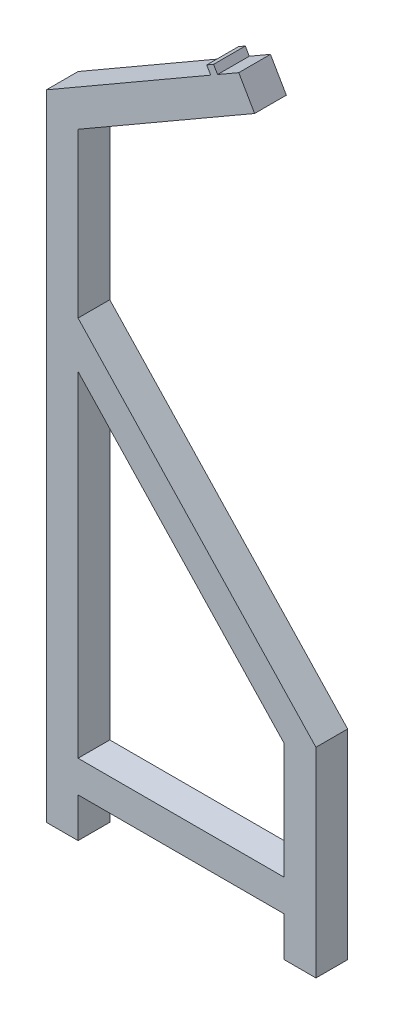
ISO-10303-21;
HEADER;
FILE_DESCRIPTION(('STEP AP214'),'2;1');
FILE_NAME('part.step','',(''),(''),'','','');
FILE_SCHEMA(('AUTOMOTIVE_DESIGN { 1 0 10303 214 1 1 1 1 }'));
ENDSEC;
DATA;
#1=APPLICATION_CONTEXT('core data for automotive mechanical design processes');
#2=APPLICATION_PROTOCOL_DEFINITION('international standard','automotive_design',2000,#1);
#3=PRODUCT_CONTEXT('',#1,'mechanical');
#4=PRODUCT('Part','Part','',(#3));
#5=PRODUCT_RELATED_PRODUCT_CATEGORY('part','',(#4));
#6=PRODUCT_DEFINITION_FORMATION('','',#4);
#7=PRODUCT_DEFINITION_CONTEXT('part definition',#1,'design');
#8=PRODUCT_DEFINITION('design','',#6,#7);
#9=PRODUCT_DEFINITION_SHAPE('','',#8);
#10=(LENGTH_UNIT() NAMED_UNIT(*) SI_UNIT(.MILLI.,.METRE.));
#11=(NAMED_UNIT(*) PLANE_ANGLE_UNIT() SI_UNIT($,.RADIAN.));
#12=(NAMED_UNIT(*) SI_UNIT($,.STERADIAN.) SOLID_ANGLE_UNIT());
#13=UNCERTAINTY_MEASURE_WITH_UNIT(LENGTH_MEASURE(1.E-05),#10,'distance_accuracy_value','');
#14=(GEOMETRIC_REPRESENTATION_CONTEXT(3) GLOBAL_UNCERTAINTY_ASSIGNED_CONTEXT((#13)) GLOBAL_UNIT_ASSIGNED_CONTEXT((#10,
#11,#12)) REPRESENTATION_CONTEXT('',''));
#15=CARTESIAN_POINT('',(0.,0.,0.));
#16=DIRECTION('',(0.,0.,1.));
#17=DIRECTION('',(1.,0.,0.));
#18=AXIS2_PLACEMENT_3D('',#15,#16,#17);
#19=CARTESIAN_POINT('',(0.,0.,4.));
#20=DIRECTION('',(0.,0.,-1.));
#21=DIRECTION('',(-1.,0.,0.));
#22=AXIS2_PLACEMENT_3D('',#19,#20,#21);
#23=PLANE('',#22);
#24=DIRECTION('',(0.,-1.,0.));
#25=VECTOR('',#24,1.);
#26=CARTESIAN_POINT('',(-197.090909090908,-191.272727272729,4.));
#27=LINE('',#26,#25);
#28=CARTESIAN_POINT('',(-197.090909090908,-111.272727272729,4.));
#29=VERTEX_POINT('',#28);
#30=CARTESIAN_POINT('',(-197.090909090908,-191.272727272729,4.));
#31=VERTEX_POINT('',#30);
#32=EDGE_CURVE('E206',#29,#31,#27,.T.);
#33=ORIENTED_EDGE('',*,*,#32,.T.);
#34=DIRECTION('',(1.,0.,0.));
#35=VECTOR('',#34,1.);
#36=CARTESIAN_POINT('',(-197.090909090908,-191.272727272729,4.));
#37=LINE('',#36,#35);
#38=CARTESIAN_POINT('',(-193.090909090908,-191.272727272729,4.));
#39=VERTEX_POINT('',#38);
#40=EDGE_CURVE('E209',#31,#39,#37,.T.);
#41=ORIENTED_EDGE('',*,*,#40,.T.);
#42=DIRECTION('',(-2.22044604924956E-13,1.,0.));
#43=VECTOR('',#42,1.);
#44=CARTESIAN_POINT('',(-193.090909090908,-191.272727272729,4.));
#45=LINE('',#44,#43);
#46=CARTESIAN_POINT('',(-193.090909090909,-186.272727272727,4.));
#47=VERTEX_POINT('',#46);
#48=EDGE_CURVE('E212',#39,#47,#45,.T.);
#49=ORIENTED_EDGE('',*,*,#48,.T.);
#50=DIRECTION('',(1.,0.,0.));
#51=VECTOR('',#50,1.);
#52=CARTESIAN_POINT('',(-193.090909090909,-186.272727272727,4.));
#53=LINE('',#52,#51);
#54=CARTESIAN_POINT('',(-167.090909090909,-186.272727272727,4.));
#55=VERTEX_POINT('',#54);
#56=EDGE_CURVE('E214',#47,#55,#53,.T.);
#57=ORIENTED_EDGE('',*,*,#56,.T.);
#58=DIRECTION('',(2.22044604924956E-13,-1.,0.));
#59=VECTOR('',#58,1.);
#60=CARTESIAN_POINT('',(-167.090909090908,-191.272727272729,4.));
#61=LINE('',#60,#59);
#62=CARTESIAN_POINT('',(-167.090909090908,-191.272727272729,4.));
#63=VERTEX_POINT('',#62);
#64=EDGE_CURVE('E216',#55,#63,#61,.T.);
#65=ORIENTED_EDGE('',*,*,#64,.T.);
#66=DIRECTION('',(1.,0.,0.));
#67=VECTOR('',#66,1.);
#68=CARTESIAN_POINT('',(-167.090909090908,-191.272727272729,4.));
#69=LINE('',#68,#67);
#70=CARTESIAN_POINT('',(-163.090909090908,-191.272727272729,4.));
#71=VERTEX_POINT('',#70);
#72=EDGE_CURVE('E218',#63,#71,#69,.T.);
#73=ORIENTED_EDGE('',*,*,#72,.T.);
#74=DIRECTION('',(0.,1.,0.));
#75=VECTOR('',#74,1.);
#76=CARTESIAN_POINT('',(-163.090909090908,-191.272727272729,4.));
#77=LINE('',#76,#75);
#78=CARTESIAN_POINT('',(-163.090909090908,-166.072727272729,4.));
#79=VERTEX_POINT('',#78);
#80=EDGE_CURVE('E220',#71,#79,#77,.T.);
#81=ORIENTED_EDGE('',*,*,#80,.T.);
#82=DIRECTION('',(-0.685358721235591,0.72820561878244,0.));
#83=VECTOR('',#82,1.);
#84=CARTESIAN_POINT('',(-163.090909090908,-166.072727272729,4.));
#85=LINE('',#84,#83);
#86=CARTESIAN_POINT('',(-193.090909090909,-134.197202986573,4.));
#87=VERTEX_POINT('',#86);
#88=EDGE_CURVE('E222',#79,#87,#85,.T.);
#89=ORIENTED_EDGE('',*,*,#88,.T.);
#90=DIRECTION('',(0.,1.,0.));
#91=VECTOR('',#90,1.);
#92=CARTESIAN_POINT('',(-193.090909090909,-134.197202986573,4.));
#93=LINE('',#92,#91);
#94=CARTESIAN_POINT('',(-193.090909090909,-113.582128349488,4.));
#95=VERTEX_POINT('',#94);
#96=EDGE_CURVE('E224',#87,#95,#93,.T.);
#97=ORIENTED_EDGE('',*,*,#96,.T.);
#98=DIRECTION('',(0.866025403784436,0.500000000000005,0.));
#99=VECTOR('',#98,1.);
#100=CARTESIAN_POINT('',(-193.090909090909,-113.582128349488,4.));
#101=LINE('',#100,#99);
#102=CARTESIAN_POINT('',(-170.824877276868,-100.726828887867,4.));
#103=VERTEX_POINT('',#102);
#104=EDGE_CURVE('E226',#95,#103,#101,.T.);
#105=ORIENTED_EDGE('',*,*,#104,.T.);
#106=DIRECTION('',(-0.500000000000002,0.866025403784438,0.));
#107=VECTOR('',#106,1.);
#108=CARTESIAN_POINT('',(-172.824877276868,-97.262727272729,4.));
#109=LINE('',#108,#107);
#110=CARTESIAN_POINT('',(-172.824877276868,-97.262727272729,4.));
#111=VERTEX_POINT('',#110);
#112=EDGE_CURVE('E228',#103,#111,#109,.T.);
#113=ORIENTED_EDGE('',*,*,#112,.T.);
#114=DIRECTION('',(-0.866025403784437,-0.500000000000002,0.));
#115=VECTOR('',#114,1.);
#116=CARTESIAN_POINT('',(-175.49752475109,-98.8057810114199,4.));
#117=LINE('',#116,#115);
#118=CARTESIAN_POINT('',(-175.49752475109,-98.8057810114199,4.));
#119=VERTEX_POINT('',#118);
#120=EDGE_CURVE('E230',#111,#119,#117,.T.);
#121=ORIENTED_EDGE('',*,*,#120,.T.);
#122=DIRECTION('',(-0.499999999999998,0.866025403784439,0.));
#123=VECTOR('',#122,1.);
#124=CARTESIAN_POINT('',(-175.49752475109,-98.8057810114199,4.));
#125=LINE('',#124,#123);
#126=CARTESIAN_POINT('',(-175.99752475109,-97.9397556076354,4.));
#127=VERTEX_POINT('',#126);
#128=EDGE_CURVE('E232',#119,#127,#125,.T.);
#129=ORIENTED_EDGE('',*,*,#128,.T.);
#130=DIRECTION('',(-0.866025403784439,-0.499999999999998,0.));
#131=VECTOR('',#130,1.);
#132=CARTESIAN_POINT('',(-175.99752475109,-97.9397556076354,4.));
#133=LINE('',#132,#131);
#134=CARTESIAN_POINT('',(-176.863550154874,-98.4397556076354,4.));
#135=VERTEX_POINT('',#134);
#136=EDGE_CURVE('E234',#127,#135,#133,.T.);
#137=ORIENTED_EDGE('',*,*,#136,.T.);
#138=DIRECTION('',(0.499999999999972,-0.866025403784455,0.));
#139=VECTOR('',#138,1.);
#140=CARTESIAN_POINT('',(-176.363550154874,-99.3057810114199,4.));
#141=LINE('',#140,#139);
#142=CARTESIAN_POINT('',(-176.363550154874,-99.3057810114199,4.));
#143=VERTEX_POINT('',#142);
#144=EDGE_CURVE('E236',#135,#143,#141,.T.);
#145=ORIENTED_EDGE('',*,*,#144,.T.);
#146=DIRECTION('',(-0.866025403784436,-0.500000000000005,0.));
#147=VECTOR('',#146,1.);
#148=CARTESIAN_POINT('',(-197.090909090908,-111.272727272729,4.));
#149=LINE('',#148,#147);
#150=EDGE_CURVE('E238',#143,#29,#149,.T.);
#151=ORIENTED_EDGE('',*,*,#150,.T.);
#152=EDGE_LOOP('',(#33,#41,#49,#57,#65,#73,#81,#89,#97,#105,#113,#121,#129,#137,#145,#151));
#153=FACE_BOUND('',#152,.T.);
#154=DIRECTION('',(0.,-1.,0.));
#155=VECTOR('',#154,1.);
#156=CARTESIAN_POINT('',(-193.090909090909,-182.272727272727,4.));
#157=LINE('',#156,#155);
#158=CARTESIAN_POINT('',(-193.090909090909,-140.033562656423,4.));
#159=VERTEX_POINT('',#158);
#160=CARTESIAN_POINT('',(-193.090909090909,-182.272727272727,4.));
#161=VERTEX_POINT('',#160);
#162=EDGE_CURVE('E170',#159,#161,#157,.T.);
#163=ORIENTED_EDGE('',*,*,#162,.F.);
#164=DIRECTION('',(-0.685358721235578,0.728205618782452,0.));
#165=VECTOR('',#164,1.);
#166=CARTESIAN_POINT('',(-167.090909090908,-167.659017037759,4.));
#167=LINE('',#166,#165);
#168=CARTESIAN_POINT('',(-167.090909090908,-167.659017037759,4.));
#169=VERTEX_POINT('',#168);
#170=EDGE_CURVE('E192',#169,#159,#167,.T.);
#171=ORIENTED_EDGE('',*,*,#170,.F.);
#172=DIRECTION('',(0.,1.,0.));
#173=VECTOR('',#172,1.);
#174=CARTESIAN_POINT('',(-167.090909090909,-182.272727272727,4.));
#175=LINE('',#174,#173);
#176=CARTESIAN_POINT('',(-167.090909090909,-182.272727272727,4.));
#177=VERTEX_POINT('',#176);
#178=EDGE_CURVE('E190',#177,#169,#175,.T.);
#179=ORIENTED_EDGE('',*,*,#178,.F.);
#180=DIRECTION('',(1.,0.,0.));
#181=VECTOR('',#180,1.);
#182=CARTESIAN_POINT('',(-193.090909090909,-182.272727272727,4.));
#183=LINE('',#182,#181);
#184=EDGE_CURVE('E178',#161,#177,#183,.T.);
#185=ORIENTED_EDGE('',*,*,#184,.F.);
#186=EDGE_LOOP('',(#163,#171,#179,#185));
#187=FACE_BOUND('',#186,.T.);
#188=ADVANCED_FACE('F33',(#153,#187),#23,.F.);
#189=CARTESIAN_POINT('',(0.,0.,0.));
#190=DIRECTION('',(0.,0.,-1.));
#191=DIRECTION('',(-1.,0.,0.));
#192=AXIS2_PLACEMENT_3D('',#189,#190,#191);
#193=PLANE('',#192);
#194=DIRECTION('',(0.,-1.,0.));
#195=VECTOR('',#194,1.);
#196=CARTESIAN_POINT('',(-197.090909090908,-191.272727272729,0.));
#197=LINE('',#196,#195);
#198=CARTESIAN_POINT('',(-197.090909090908,-111.272727272729,0.));
#199=VERTEX_POINT('',#198);
#200=CARTESIAN_POINT('',(-197.090909090908,-191.272727272729,0.));
#201=VERTEX_POINT('',#200);
#202=EDGE_CURVE('E186',#199,#201,#197,.T.);
#203=ORIENTED_EDGE('',*,*,#202,.F.);
#204=DIRECTION('',(-0.866025403784436,-0.500000000000005,0.));
#205=VECTOR('',#204,1.);
#206=CARTESIAN_POINT('',(-197.090909090908,-111.272727272729,0.));
#207=LINE('',#206,#205);
#208=CARTESIAN_POINT('',(-176.363550154874,-99.3057810114199,0.));
#209=VERTEX_POINT('',#208);
#210=EDGE_CURVE('E210',#209,#199,#207,.T.);
#211=ORIENTED_EDGE('',*,*,#210,.F.);
#212=DIRECTION('',(0.499999999999972,-0.866025403784455,0.));
#213=VECTOR('',#212,1.);
#214=CARTESIAN_POINT('',(-176.363550154874,-99.3057810114199,0.));
#215=LINE('',#214,#213);
#216=CARTESIAN_POINT('',(-176.863550154874,-98.4397556076354,0.));
#217=VERTEX_POINT('',#216);
#218=EDGE_CURVE('E269',#217,#209,#215,.T.);
#219=ORIENTED_EDGE('',*,*,#218,.F.);
#220=DIRECTION('',(-0.866025403784439,-0.499999999999998,0.));
#221=VECTOR('',#220,1.);
#222=CARTESIAN_POINT('',(-175.99752475109,-97.9397556076354,0.));
#223=LINE('',#222,#221);
#224=CARTESIAN_POINT('',(-175.99752475109,-97.9397556076354,0.));
#225=VERTEX_POINT('',#224);
#226=EDGE_CURVE('E267',#225,#217,#223,.T.);
#227=ORIENTED_EDGE('',*,*,#226,.F.);
#228=DIRECTION('',(-0.499999999999998,0.866025403784439,0.));
#229=VECTOR('',#228,1.);
#230=CARTESIAN_POINT('',(-175.49752475109,-98.8057810114199,0.));
#231=LINE('',#230,#229);
#232=CARTESIAN_POINT('',(-175.49752475109,-98.8057810114199,0.));
#233=VERTEX_POINT('',#232);
#234=EDGE_CURVE('E265',#233,#225,#231,.T.);
#235=ORIENTED_EDGE('',*,*,#234,.F.);
#236=DIRECTION('',(-0.866025403784437,-0.500000000000002,0.));
#237=VECTOR('',#236,1.);
#238=CARTESIAN_POINT('',(-175.49752475109,-98.8057810114199,0.));
#239=LINE('',#238,#237);
#240=CARTESIAN_POINT('',(-172.824877276868,-97.262727272729,0.));
#241=VERTEX_POINT('',#240);
#242=EDGE_CURVE('E263',#241,#233,#239,.T.);
#243=ORIENTED_EDGE('',*,*,#242,.F.);
#244=DIRECTION('',(-0.500000000000002,0.866025403784438,0.));
#245=VECTOR('',#244,1.);
#246=CARTESIAN_POINT('',(-172.824877276868,-97.262727272729,0.));
#247=LINE('',#246,#245);
#248=CARTESIAN_POINT('',(-170.824877276868,-100.726828887867,0.));
#249=VERTEX_POINT('',#248);
#250=EDGE_CURVE('E261',#249,#241,#247,.T.);
#251=ORIENTED_EDGE('',*,*,#250,.F.);
#252=DIRECTION('',(0.866025403784436,0.500000000000005,0.));
#253=VECTOR('',#252,1.);
#254=CARTESIAN_POINT('',(-193.090909090909,-113.582128349488,0.));
#255=LINE('',#254,#253);
#256=CARTESIAN_POINT('',(-193.090909090909,-113.582128349488,0.));
#257=VERTEX_POINT('',#256);
#258=EDGE_CURVE('E259',#257,#249,#255,.T.);
#259=ORIENTED_EDGE('',*,*,#258,.F.);
#260=DIRECTION('',(0.,1.,0.));
#261=VECTOR('',#260,1.);
#262=CARTESIAN_POINT('',(-193.090909090909,-134.197202986573,0.));
#263=LINE('',#262,#261);
#264=CARTESIAN_POINT('',(-193.090909090909,-134.197202986573,0.));
#265=VERTEX_POINT('',#264);
#266=EDGE_CURVE('E257',#265,#257,#263,.T.);
#267=ORIENTED_EDGE('',*,*,#266,.F.);
#268=DIRECTION('',(-0.685358721235591,0.72820561878244,0.));
#269=VECTOR('',#268,1.);
#270=CARTESIAN_POINT('',(-163.090909090908,-166.072727272729,0.));
#271=LINE('',#270,#269);
#272=CARTESIAN_POINT('',(-163.090909090908,-166.072727272729,0.));
#273=VERTEX_POINT('',#272);
#274=EDGE_CURVE('E255',#273,#265,#271,.T.);
#275=ORIENTED_EDGE('',*,*,#274,.F.);
#276=DIRECTION('',(0.,1.,0.));
#277=VECTOR('',#276,1.);
#278=CARTESIAN_POINT('',(-163.090909090908,-191.272727272729,0.));
#279=LINE('',#278,#277);
#280=CARTESIAN_POINT('',(-163.090909090908,-191.272727272729,0.));
#281=VERTEX_POINT('',#280);
#282=EDGE_CURVE('E253',#281,#273,#279,.T.);
#283=ORIENTED_EDGE('',*,*,#282,.F.);
#284=DIRECTION('',(1.,0.,0.));
#285=VECTOR('',#284,1.);
#286=CARTESIAN_POINT('',(-167.090909090908,-191.272727272729,0.));
#287=LINE('',#286,#285);
#288=CARTESIAN_POINT('',(-167.090909090908,-191.272727272729,0.));
#289=VERTEX_POINT('',#288);
#290=EDGE_CURVE('E251',#289,#281,#287,.T.);
#291=ORIENTED_EDGE('',*,*,#290,.F.);
#292=DIRECTION('',(2.22044604924956E-13,-1.,0.));
#293=VECTOR('',#292,1.);
#294=CARTESIAN_POINT('',(-167.090909090908,-191.272727272729,0.));
#295=LINE('',#294,#293);
#296=CARTESIAN_POINT('',(-167.090909090909,-186.272727272727,0.));
#297=VERTEX_POINT('',#296);
#298=EDGE_CURVE('E249',#297,#289,#295,.T.);
#299=ORIENTED_EDGE('',*,*,#298,.F.);
#300=DIRECTION('',(1.,0.,0.));
#301=VECTOR('',#300,1.);
#302=CARTESIAN_POINT('',(-193.090909090909,-186.272727272727,0.));
#303=LINE('',#302,#301);
#304=CARTESIAN_POINT('',(-193.090909090909,-186.272727272727,0.));
#305=VERTEX_POINT('',#304);
#306=EDGE_CURVE('E247',#305,#297,#303,.T.);
#307=ORIENTED_EDGE('',*,*,#306,.F.);
#308=DIRECTION('',(-2.22044604924956E-13,1.,0.));
#309=VECTOR('',#308,1.);
#310=CARTESIAN_POINT('',(-193.090909090908,-191.272727272729,0.));
#311=LINE('',#310,#309);
#312=CARTESIAN_POINT('',(-193.090909090908,-191.272727272729,0.));
#313=VERTEX_POINT('',#312);
#314=EDGE_CURVE('E245',#313,#305,#311,.T.);
#315=ORIENTED_EDGE('',*,*,#314,.F.);
#316=DIRECTION('',(1.,0.,0.));
#317=VECTOR('',#316,1.);
#318=CARTESIAN_POINT('',(-197.090909090908,-191.272727272729,0.));
#319=LINE('',#318,#317);
#320=EDGE_CURVE('E243',#201,#313,#319,.T.);
#321=ORIENTED_EDGE('',*,*,#320,.F.);
#322=EDGE_LOOP('',(#203,#211,#219,#227,#235,#243,#251,#259,#267,#275,#283,#291,#299,#307,#315,#321));
#323=FACE_BOUND('',#322,.T.);
#324=DIRECTION('',(-0.685358721235578,0.728205618782452,0.));
#325=VECTOR('',#324,1.);
#326=CARTESIAN_POINT('',(-167.090909090908,-167.659017037759,0.));
#327=LINE('',#326,#325);
#328=CARTESIAN_POINT('',(-167.090909090908,-167.659017037759,0.));
#329=VERTEX_POINT('',#328);
#330=CARTESIAN_POINT('',(-193.090909090909,-140.033562656423,0.));
#331=VERTEX_POINT('',#330);
#332=EDGE_CURVE('E179',#329,#331,#327,.T.);
#333=ORIENTED_EDGE('',*,*,#332,.T.);
#334=DIRECTION('',(0.,-1.,0.));
#335=VECTOR('',#334,1.);
#336=CARTESIAN_POINT('',(-193.090909090909,-182.272727272727,0.));
#337=LINE('',#336,#335);
#338=CARTESIAN_POINT('',(-193.090909090909,-182.272727272727,0.));
#339=VERTEX_POINT('',#338);
#340=EDGE_CURVE('E56',#331,#339,#337,.T.);
#341=ORIENTED_EDGE('',*,*,#340,.T.);
#342=DIRECTION('',(1.,0.,0.));
#343=VECTOR('',#342,1.);
#344=CARTESIAN_POINT('',(-193.090909090909,-182.272727272727,0.));
#345=LINE('',#344,#343);
#346=CARTESIAN_POINT('',(-167.090909090909,-182.272727272727,0.));
#347=VERTEX_POINT('',#346);
#348=EDGE_CURVE('E185',#339,#347,#345,.T.);
#349=ORIENTED_EDGE('',*,*,#348,.T.);
#350=DIRECTION('',(0.,1.,0.));
#351=VECTOR('',#350,1.);
#352=CARTESIAN_POINT('',(-167.090909090909,-182.272727272727,0.));
#353=LINE('',#352,#351);
#354=EDGE_CURVE('E198',#347,#329,#353,.T.);
#355=ORIENTED_EDGE('',*,*,#354,.T.);
#356=EDGE_LOOP('',(#333,#341,#349,#355));
#357=FACE_BOUND('',#356,.T.);
#358=ADVANCED_FACE('F323',(#323,#357),#193,.T.);
#359=CARTESIAN_POINT('',(-197.090909090908,-191.272727272729,4.));
#360=DIRECTION('',(1.,0.,0.));
#361=DIRECTION('',(0.,0.,-1.));
#362=AXIS2_PLACEMENT_3D('',#359,#360,#361);
#363=PLANE('',#362);
#364=ORIENTED_EDGE('',*,*,#202,.T.);
#365=DIRECTION('',(0.,0.,-1.));
#366=VECTOR('',#365,1.);
#367=CARTESIAN_POINT('',(-197.090909090908,-191.272727272729,4.));
#368=LINE('',#367,#366);
#369=EDGE_CURVE('E11',#31,#201,#368,.T.);
#370=ORIENTED_EDGE('',*,*,#369,.F.);
#371=ORIENTED_EDGE('',*,*,#32,.F.);
#372=DIRECTION('',(0.,0.,-1.));
#373=VECTOR('',#372,1.);
#374=CARTESIAN_POINT('',(-197.090909090908,-111.272727272729,4.));
#375=LINE('',#374,#373);
#376=EDGE_CURVE('E240',#29,#199,#375,.T.);
#377=ORIENTED_EDGE('',*,*,#376,.T.);
#378=EDGE_LOOP('',(#364,#370,#371,#377));
#379=FACE_BOUND('',#378,.T.);
#380=ADVANCED_FACE('F35',(#379),#363,.F.);
#381=CARTESIAN_POINT('',(-197.090909090908,-191.272727272729,4.));
#382=DIRECTION('',(0.,1.,0.));
#383=DIRECTION('',(0.,0.,1.));
#384=AXIS2_PLACEMENT_3D('',#381,#382,#383);
#385=PLANE('',#384);
#386=ORIENTED_EDGE('',*,*,#320,.T.);
#387=DIRECTION('',(0.,0.,-1.));
#388=VECTOR('',#387,1.);
#389=CARTESIAN_POINT('',(-193.090909090908,-191.272727272729,4.));
#390=LINE('',#389,#388);
#391=EDGE_CURVE('E41',#39,#313,#390,.T.);
#392=ORIENTED_EDGE('',*,*,#391,.F.);
#393=ORIENTED_EDGE('',*,*,#40,.F.);
#394=ORIENTED_EDGE('',*,*,#369,.T.);
#395=EDGE_LOOP('',(#386,#392,#393,#394));
#396=FACE_BOUND('',#395,.T.);
#397=ADVANCED_FACE('F340',(#396),#385,.F.);
#398=CARTESIAN_POINT('',(-193.090909090908,-191.272727272729,4.));
#399=DIRECTION('',(-1.,-2.22044604924956E-13,0.));
#400=DIRECTION('',(2.22044604924956E-13,-1.,0.));
#401=AXIS2_PLACEMENT_3D('',#398,#399,#400);
#402=PLANE('',#401);
#403=ORIENTED_EDGE('',*,*,#314,.T.);
#404=DIRECTION('',(0.,0.,-1.));
#405=VECTOR('',#404,1.);
#406=CARTESIAN_POINT('',(-193.090909090909,-186.272727272727,4.));
#407=LINE('',#406,#405);
#408=EDGE_CURVE('E310',#47,#305,#407,.T.);
#409=ORIENTED_EDGE('',*,*,#408,.F.);
#410=ORIENTED_EDGE('',*,*,#48,.F.);
#411=ORIENTED_EDGE('',*,*,#391,.T.);
#412=EDGE_LOOP('',(#403,#409,#410,#411));
#413=FACE_BOUND('',#412,.T.);
#414=ADVANCED_FACE('F317',(#413),#402,.F.);
#415=CARTESIAN_POINT('',(-193.090909090909,-186.272727272727,4.));
#416=DIRECTION('',(0.,1.,0.));
#417=DIRECTION('',(0.,0.,1.));
#418=AXIS2_PLACEMENT_3D('',#415,#416,#417);
#419=PLANE('',#418);
#420=ORIENTED_EDGE('',*,*,#306,.T.);
#421=DIRECTION('',(0.,0.,-1.));
#422=VECTOR('',#421,1.);
#423=CARTESIAN_POINT('',(-167.090909090909,-186.272727272727,4.));
#424=LINE('',#423,#422);
#425=EDGE_CURVE('E307',#55,#297,#424,.T.);
#426=ORIENTED_EDGE('',*,*,#425,.F.);
#427=ORIENTED_EDGE('',*,*,#56,.F.);
#428=ORIENTED_EDGE('',*,*,#408,.T.);
#429=EDGE_LOOP('',(#420,#426,#427,#428));
#430=FACE_BOUND('',#429,.T.);
#431=ADVANCED_FACE('F329',(#430),#419,.F.);
#432=CARTESIAN_POINT('',(-167.090909090908,-191.272727272729,4.));
#433=DIRECTION('',(1.,2.22044604924956E-13,0.));
#434=DIRECTION('',(-2.22044604924956E-13,1.,0.));
#435=AXIS2_PLACEMENT_3D('',#432,#433,#434);
#436=PLANE('',#435);
#437=ORIENTED_EDGE('',*,*,#298,.T.);
#438=DIRECTION('',(0.,0.,-1.));
#439=VECTOR('',#438,1.);
#440=CARTESIAN_POINT('',(-167.090909090908,-191.272727272729,4.));
#441=LINE('',#440,#439);
#442=EDGE_CURVE('E304',#63,#289,#441,.T.);
#443=ORIENTED_EDGE('',*,*,#442,.F.);
#444=ORIENTED_EDGE('',*,*,#64,.F.);
#445=ORIENTED_EDGE('',*,*,#425,.T.);
#446=EDGE_LOOP('',(#437,#443,#444,#445));
#447=FACE_BOUND('',#446,.T.);
#448=ADVANCED_FACE('F333',(#447),#436,.F.);
#449=CARTESIAN_POINT('',(-167.090909090908,-191.272727272729,4.));
#450=DIRECTION('',(0.,1.,0.));
#451=DIRECTION('',(-1.,0.,0.));
#452=AXIS2_PLACEMENT_3D('',#449,#450,#451);
#453=PLANE('',#452);
#454=ORIENTED_EDGE('',*,*,#290,.T.);
#455=DIRECTION('',(0.,0.,-1.));
#456=VECTOR('',#455,1.);
#457=CARTESIAN_POINT('',(-163.090909090908,-191.272727272729,4.));
#458=LINE('',#457,#456);
#459=EDGE_CURVE('E301',#71,#281,#458,.T.);
#460=ORIENTED_EDGE('',*,*,#459,.F.);
#461=ORIENTED_EDGE('',*,*,#72,.F.);
#462=ORIENTED_EDGE('',*,*,#442,.T.);
#463=EDGE_LOOP('',(#454,#460,#461,#462));
#464=FACE_BOUND('',#463,.T.);
#465=ADVANCED_FACE('F393',(#464),#453,.F.);
#466=CARTESIAN_POINT('',(-163.090909090908,-191.272727272729,4.));
#467=DIRECTION('',(-1.,0.,0.));
#468=DIRECTION('',(0.,-1.,0.));
#469=AXIS2_PLACEMENT_3D('',#466,#467,#468);
#470=PLANE('',#469);
#471=ORIENTED_EDGE('',*,*,#282,.T.);
#472=DIRECTION('',(0.,0.,-1.));
#473=VECTOR('',#472,1.);
#474=CARTESIAN_POINT('',(-163.090909090908,-166.072727272729,4.));
#475=LINE('',#474,#473);
#476=EDGE_CURVE('E298',#79,#273,#475,.T.);
#477=ORIENTED_EDGE('',*,*,#476,.F.);
#478=ORIENTED_EDGE('',*,*,#80,.F.);
#479=ORIENTED_EDGE('',*,*,#459,.T.);
#480=EDGE_LOOP('',(#471,#477,#478,#479));
#481=FACE_BOUND('',#480,.T.);
#482=ADVANCED_FACE('F390',(#481),#470,.F.);
#483=CARTESIAN_POINT('',(-163.090909090908,-166.072727272729,4.));
#484=DIRECTION('',(-0.72820561878244,-0.685358721235591,0.));
#485=DIRECTION('',(0.685358721235591,-0.72820561878244,0.));
#486=AXIS2_PLACEMENT_3D('',#483,#484,#485);
#487=PLANE('',#486);
#488=ORIENTED_EDGE('',*,*,#274,.T.);
#489=DIRECTION('',(0.,0.,-1.));
#490=VECTOR('',#489,1.);
#491=CARTESIAN_POINT('',(-193.090909090909,-134.197202986573,4.));
#492=LINE('',#491,#490);
#493=EDGE_CURVE('E295',#87,#265,#492,.T.);
#494=ORIENTED_EDGE('',*,*,#493,.F.);
#495=ORIENTED_EDGE('',*,*,#88,.F.);
#496=ORIENTED_EDGE('',*,*,#476,.T.);
#497=EDGE_LOOP('',(#488,#494,#495,#496));
#498=FACE_BOUND('',#497,.T.);
#499=ADVANCED_FACE('F386',(#498),#487,.F.);
#500=CARTESIAN_POINT('',(-193.090909090909,-134.197202986573,4.));
#501=DIRECTION('',(-1.,0.,0.));
#502=DIRECTION('',(0.,0.,1.));
#503=AXIS2_PLACEMENT_3D('',#500,#501,#502);
#504=PLANE('',#503);
#505=ORIENTED_EDGE('',*,*,#266,.T.);
#506=DIRECTION('',(0.,0.,-1.));
#507=VECTOR('',#506,1.);
#508=CARTESIAN_POINT('',(-193.090909090909,-113.582128349488,4.));
#509=LINE('',#508,#507);
#510=EDGE_CURVE('E292',#95,#257,#509,.T.);
#511=ORIENTED_EDGE('',*,*,#510,.F.);
#512=ORIENTED_EDGE('',*,*,#96,.F.);
#513=ORIENTED_EDGE('',*,*,#493,.T.);
#514=EDGE_LOOP('',(#505,#511,#512,#513));
#515=FACE_BOUND('',#514,.T.);
#516=ADVANCED_FACE('F382',(#515),#504,.F.);
#517=CARTESIAN_POINT('',(-193.090909090909,-113.582128349488,4.));
#518=DIRECTION('',(-0.500000000000005,0.866025403784436,0.));
#519=DIRECTION('',(-0.866025403784436,-0.500000000000005,0.));
#520=AXIS2_PLACEMENT_3D('',#517,#518,#519);
#521=PLANE('',#520);
#522=ORIENTED_EDGE('',*,*,#258,.T.);
#523=DIRECTION('',(0.,0.,-1.));
#524=VECTOR('',#523,1.);
#525=CARTESIAN_POINT('',(-170.824877276868,-100.726828887867,4.));
#526=LINE('',#525,#524);
#527=EDGE_CURVE('E289',#103,#249,#526,.T.);
#528=ORIENTED_EDGE('',*,*,#527,.F.);
#529=ORIENTED_EDGE('',*,*,#104,.F.);
#530=ORIENTED_EDGE('',*,*,#510,.T.);
#531=EDGE_LOOP('',(#522,#528,#529,#530));
#532=FACE_BOUND('',#531,.T.);
#533=ADVANCED_FACE('F377',(#532),#521,.F.);
#534=CARTESIAN_POINT('',(-172.824877276868,-97.262727272729,4.));
#535=DIRECTION('',(-0.866025403784438,-0.500000000000002,0.));
#536=DIRECTION('',(0.500000000000002,-0.866025403784438,0.));
#537=AXIS2_PLACEMENT_3D('',#534,#535,#536);
#538=PLANE('',#537);
#539=ORIENTED_EDGE('',*,*,#250,.T.);
#540=DIRECTION('',(0.,0.,-1.));
#541=VECTOR('',#540,1.);
#542=CARTESIAN_POINT('',(-172.824877276868,-97.262727272729,4.));
#543=LINE('',#542,#541);
#544=EDGE_CURVE('E286',#111,#241,#543,.T.);
#545=ORIENTED_EDGE('',*,*,#544,.F.);
#546=ORIENTED_EDGE('',*,*,#112,.F.);
#547=ORIENTED_EDGE('',*,*,#527,.T.);
#548=EDGE_LOOP('',(#539,#545,#546,#547));
#549=FACE_BOUND('',#548,.T.);
#550=ADVANCED_FACE('F371',(#549),#538,.F.);
#551=CARTESIAN_POINT('',(-175.49752475109,-98.8057810114199,4.));
#552=DIRECTION('',(0.500000000000002,-0.866025403784438,0.));
#553=DIRECTION('',(0.866025403784437,0.500000000000002,0.));
#554=AXIS2_PLACEMENT_3D('',#551,#552,#553);
#555=PLANE('',#554);
#556=ORIENTED_EDGE('',*,*,#242,.T.);
#557=DIRECTION('',(0.,0.,-1.));
#558=VECTOR('',#557,1.);
#559=CARTESIAN_POINT('',(-175.49752475109,-98.8057810114199,4.));
#560=LINE('',#559,#558);
#561=EDGE_CURVE('E283',#119,#233,#560,.T.);
#562=ORIENTED_EDGE('',*,*,#561,.F.);
#563=ORIENTED_EDGE('',*,*,#120,.F.);
#564=ORIENTED_EDGE('',*,*,#544,.T.);
#565=EDGE_LOOP('',(#556,#562,#563,#564));
#566=FACE_BOUND('',#565,.T.);
#567=ADVANCED_FACE('F367',(#566),#555,.F.);
#568=CARTESIAN_POINT('',(-175.49752475109,-98.8057810114199,4.));
#569=DIRECTION('',(-0.86602540378444,-0.499999999999999,0.));
#570=DIRECTION('',(0.499999999999999,-0.86602540378444,0.));
#571=AXIS2_PLACEMENT_3D('',#568,#569,#570);
#572=PLANE('',#571);
#573=ORIENTED_EDGE('',*,*,#234,.T.);
#574=DIRECTION('',(0.,0.,-1.));
#575=VECTOR('',#574,1.);
#576=CARTESIAN_POINT('',(-175.99752475109,-97.9397556076354,4.));
#577=LINE('',#576,#575);
#578=EDGE_CURVE('E280',#127,#225,#577,.T.);
#579=ORIENTED_EDGE('',*,*,#578,.F.);
#580=ORIENTED_EDGE('',*,*,#128,.F.);
#581=ORIENTED_EDGE('',*,*,#561,.T.);
#582=EDGE_LOOP('',(#573,#579,#580,#581));
#583=FACE_BOUND('',#582,.T.);
#584=ADVANCED_FACE('F362',(#583),#572,.F.);
#585=CARTESIAN_POINT('',(-175.99752475109,-97.9397556076354,4.));
#586=DIRECTION('',(0.499999999999999,-0.86602540378444,0.));
#587=DIRECTION('',(0.86602540378444,0.499999999999999,0.));
#588=AXIS2_PLACEMENT_3D('',#585,#586,#587);
#589=PLANE('',#588);
#590=ORIENTED_EDGE('',*,*,#226,.T.);
#591=DIRECTION('',(0.,0.,-1.));
#592=VECTOR('',#591,1.);
#593=CARTESIAN_POINT('',(-176.863550154874,-98.4397556076354,4.));
#594=LINE('',#593,#592);
#595=EDGE_CURVE('E277',#135,#217,#594,.T.);
#596=ORIENTED_EDGE('',*,*,#595,.F.);
#597=ORIENTED_EDGE('',*,*,#136,.F.);
#598=ORIENTED_EDGE('',*,*,#578,.T.);
#599=EDGE_LOOP('',(#590,#596,#597,#598));
#600=FACE_BOUND('',#599,.T.);
#601=ADVANCED_FACE('F356',(#600),#589,.F.);
#602=CARTESIAN_POINT('',(-176.363550154874,-99.3057810114199,4.));
#603=DIRECTION('',(0.866025403784455,0.499999999999972,0.));
#604=DIRECTION('',(-0.499999999999972,0.866025403784455,0.));
#605=AXIS2_PLACEMENT_3D('',#602,#603,#604);
#606=PLANE('',#605);
#607=ORIENTED_EDGE('',*,*,#218,.T.);
#608=DIRECTION('',(0.,0.,-1.));
#609=VECTOR('',#608,1.);
#610=CARTESIAN_POINT('',(-176.363550154874,-99.3057810114199,4.));
#611=LINE('',#610,#609);
#612=EDGE_CURVE('E274',#143,#209,#611,.T.);
#613=ORIENTED_EDGE('',*,*,#612,.F.);
#614=ORIENTED_EDGE('',*,*,#144,.F.);
#615=ORIENTED_EDGE('',*,*,#595,.T.);
#616=EDGE_LOOP('',(#607,#613,#614,#615));
#617=FACE_BOUND('',#616,.T.);
#618=ADVANCED_FACE('F352',(#617),#606,.F.);
#619=CARTESIAN_POINT('',(-197.090909090908,-111.272727272729,4.));
#620=DIRECTION('',(0.500000000000005,-0.866025403784436,0.));
#621=DIRECTION('',(0.866025403784436,0.500000000000005,0.));
#622=AXIS2_PLACEMENT_3D('',#619,#620,#621);
#623=PLANE('',#622);
#624=ORIENTED_EDGE('',*,*,#210,.T.);
#625=ORIENTED_EDGE('',*,*,#376,.F.);
#626=ORIENTED_EDGE('',*,*,#150,.F.);
#627=ORIENTED_EDGE('',*,*,#612,.T.);
#628=EDGE_LOOP('',(#624,#625,#626,#627));
#629=FACE_BOUND('',#628,.T.);
#630=ADVANCED_FACE('F347',(#629),#623,.F.);
#631=CARTESIAN_POINT('',(-193.090909090909,-182.272727272727,4.));
#632=DIRECTION('',(1.,0.,0.));
#633=DIRECTION('',(0.,0.,-1.));
#634=AXIS2_PLACEMENT_3D('',#631,#632,#633);
#635=PLANE('',#634);
#636=ORIENTED_EDGE('',*,*,#340,.F.);
#637=DIRECTION('',(0.,0.,-1.));
#638=VECTOR('',#637,1.);
#639=CARTESIAN_POINT('',(-193.090909090909,-140.033562656423,4.));
#640=LINE('',#639,#638);
#641=EDGE_CURVE('E174',#159,#331,#640,.T.);
#642=ORIENTED_EDGE('',*,*,#641,.F.);
#643=ORIENTED_EDGE('',*,*,#162,.T.);
#644=DIRECTION('',(0.,0.,-1.));
#645=VECTOR('',#644,1.);
#646=CARTESIAN_POINT('',(-193.090909090909,-182.272727272727,4.));
#647=LINE('',#646,#645);
#648=EDGE_CURVE('E173',#161,#339,#647,.T.);
#649=ORIENTED_EDGE('',*,*,#648,.T.);
#650=EDGE_LOOP('',(#636,#642,#643,#649));
#651=FACE_BOUND('',#650,.T.);
#652=ADVANCED_FACE('F172',(#651),#635,.T.);
#653=CARTESIAN_POINT('',(-193.090909090909,-182.272727272727,4.));
#654=DIRECTION('',(0.,1.,0.));
#655=DIRECTION('',(0.,0.,1.));
#656=AXIS2_PLACEMENT_3D('',#653,#654,#655);
#657=PLANE('',#656);
#658=ORIENTED_EDGE('',*,*,#348,.F.);
#659=ORIENTED_EDGE('',*,*,#648,.F.);
#660=ORIENTED_EDGE('',*,*,#184,.T.);
#661=DIRECTION('',(0.,0.,-1.));
#662=VECTOR('',#661,1.);
#663=CARTESIAN_POINT('',(-167.090909090909,-182.272727272727,4.));
#664=LINE('',#663,#662);
#665=EDGE_CURVE('E187',#177,#347,#664,.T.);
#666=ORIENTED_EDGE('',*,*,#665,.T.);
#667=EDGE_LOOP('',(#658,#659,#660,#666));
#668=FACE_BOUND('',#667,.T.);
#669=ADVANCED_FACE('F182',(#668),#657,.T.);
#670=CARTESIAN_POINT('',(-167.090909090909,-182.272727272727,4.));
#671=DIRECTION('',(-1.,0.,0.));
#672=DIRECTION('',(0.,-1.,0.));
#673=AXIS2_PLACEMENT_3D('',#670,#671,#672);
#674=PLANE('',#673);
#675=ORIENTED_EDGE('',*,*,#354,.F.);
#676=ORIENTED_EDGE('',*,*,#665,.F.);
#677=ORIENTED_EDGE('',*,*,#178,.T.);
#678=DIRECTION('',(0.,0.,-1.));
#679=VECTOR('',#678,1.);
#680=CARTESIAN_POINT('',(-167.090909090908,-167.659017037759,4.));
#681=LINE('',#680,#679);
#682=EDGE_CURVE('E48',#169,#329,#681,.T.);
#683=ORIENTED_EDGE('',*,*,#682,.T.);
#684=EDGE_LOOP('',(#675,#676,#677,#683));
#685=FACE_BOUND('',#684,.T.);
#686=ADVANCED_FACE('F475',(#685),#674,.T.);
#687=CARTESIAN_POINT('',(-167.090909090908,-167.659017037759,4.));
#688=DIRECTION('',(-0.728205618782452,-0.685358721235578,0.));
#689=DIRECTION('',(0.685358721235578,-0.728205618782452,0.));
#690=AXIS2_PLACEMENT_3D('',#687,#688,#689);
#691=PLANE('',#690);
#692=ORIENTED_EDGE('',*,*,#332,.F.);
#693=ORIENTED_EDGE('',*,*,#682,.F.);
#694=ORIENTED_EDGE('',*,*,#170,.T.);
#695=ORIENTED_EDGE('',*,*,#641,.T.);
#696=EDGE_LOOP('',(#692,#693,#694,#695));
#697=FACE_BOUND('',#696,.T.);
#698=ADVANCED_FACE('F481',(#697),#691,.T.);
#699=CLOSED_SHELL('',(#188,#358,#380,#397,#414,#431,#448,#465,#482,#499,#516,#533,#550,#567,
#584,#601,#618,#630,#652,#669,#686,#698));
#700=MANIFOLD_SOLID_BREP('B2',#699);
#701=ADVANCED_BREP_SHAPE_REPRESENTATION('',(#18,#700),#14);
#702=SHAPE_DEFINITION_REPRESENTATION(#9,#701);
ENDSEC;
END-ISO-10303-21;
